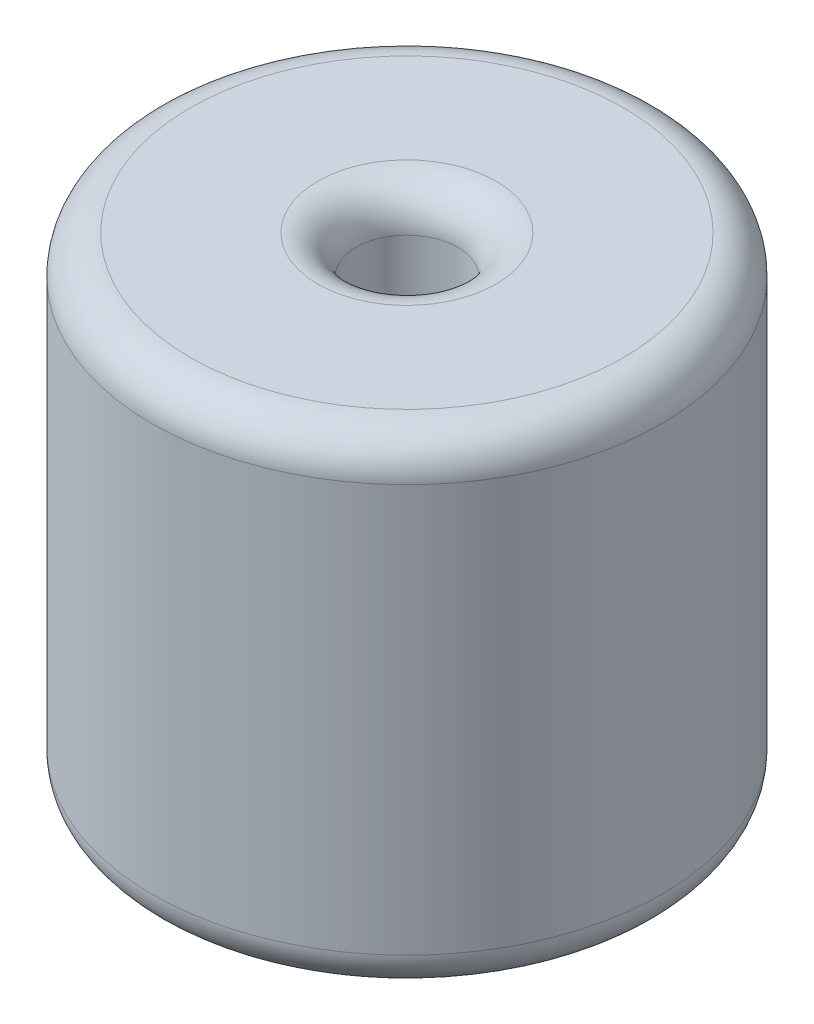
ISO-10303-21;
HEADER;
FILE_DESCRIPTION(('STEP AP214'),'2;1');
FILE_NAME('part.step','',(''),(''),'','','');
FILE_SCHEMA(('AUTOMOTIVE_DESIGN { 1 0 10303 214 1 1 1 1 }'));
ENDSEC;
DATA;
#1=APPLICATION_CONTEXT('core data for automotive mechanical design processes');
#2=APPLICATION_PROTOCOL_DEFINITION('international standard','automotive_design',2000,#1);
#3=PRODUCT_CONTEXT('',#1,'mechanical');
#4=PRODUCT('Part','Part','',(#3));
#5=PRODUCT_RELATED_PRODUCT_CATEGORY('part','',(#4));
#6=PRODUCT_DEFINITION_FORMATION('','',#4);
#7=PRODUCT_DEFINITION_CONTEXT('part definition',#1,'design');
#8=PRODUCT_DEFINITION('design','',#6,#7);
#9=PRODUCT_DEFINITION_SHAPE('','',#8);
#10=(LENGTH_UNIT() NAMED_UNIT(*) SI_UNIT(.MILLI.,.METRE.));
#11=(NAMED_UNIT(*) PLANE_ANGLE_UNIT() SI_UNIT($,.RADIAN.));
#12=(NAMED_UNIT(*) SI_UNIT($,.STERADIAN.) SOLID_ANGLE_UNIT());
#13=UNCERTAINTY_MEASURE_WITH_UNIT(LENGTH_MEASURE(1.E-05),#10,'distance_accuracy_value','');
#14=(GEOMETRIC_REPRESENTATION_CONTEXT(3) GLOBAL_UNCERTAINTY_ASSIGNED_CONTEXT((#13)) GLOBAL_UNIT_ASSIGNED_CONTEXT((#10,
#11,#12)) REPRESENTATION_CONTEXT('',''));
#15=CARTESIAN_POINT('',(0.,0.,0.));
#16=DIRECTION('',(0.,0.,1.));
#17=DIRECTION('',(1.,0.,0.));
#18=AXIS2_PLACEMENT_3D('',#15,#16,#17);
#19=CARTESIAN_POINT('',(0.,38.,0.));
#20=DIRECTION('',(0.,-1.,0.));
#21=DIRECTION('',(0.,0.,-1.));
#22=AXIS2_PLACEMENT_3D('',#19,#20,#21);
#23=CYLINDRICAL_SURFACE('',#22,20.);
#24=CARTESIAN_POINT('',(0.,3.,0.));
#25=DIRECTION('',(0.,1.,0.));
#26=DIRECTION('',(0.,0.,1.));
#27=AXIS2_PLACEMENT_3D('',#24,#25,#26);
#28=CIRCLE('',#27,20.);
#29=CARTESIAN_POINT('',(0.,3.,20.));
#30=VERTEX_POINT('',#29);
#31=EDGE_CURVE('E56',#30,#30,#28,.T.);
#32=ORIENTED_EDGE('',*,*,#31,.T.);
#33=EDGE_LOOP('',(#32));
#34=FACE_BOUND('',#33,.T.);
#35=CARTESIAN_POINT('',(0.,35.,0.));
#36=DIRECTION('',(0.,1.,0.));
#37=DIRECTION('',(0.,0.,1.));
#38=AXIS2_PLACEMENT_3D('',#35,#36,#37);
#39=CIRCLE('',#38,20.);
#40=CARTESIAN_POINT('',(0.,35.,20.));
#41=VERTEX_POINT('',#40);
#42=EDGE_CURVE('E59',#41,#41,#39,.F.);
#43=ORIENTED_EDGE('',*,*,#42,.T.);
#44=EDGE_LOOP('',(#43));
#45=FACE_BOUND('',#44,.T.);
#46=ADVANCED_FACE('F30',(#34,#45),#23,.T.);
#47=CARTESIAN_POINT('',(0.,38.,0.));
#48=DIRECTION('',(0.,1.,0.));
#49=DIRECTION('',(0.,0.,1.));
#50=AXIS2_PLACEMENT_3D('',#47,#48,#49);
#51=PLANE('',#50);
#52=CARTESIAN_POINT('',(0.,38.,0.));
#53=DIRECTION('',(0.,1.,0.));
#54=DIRECTION('',(0.,0.,1.));
#55=AXIS2_PLACEMENT_3D('',#52,#53,#54);
#56=CIRCLE('',#55,17.);
#57=CARTESIAN_POINT('',(0.,38.,17.));
#58=VERTEX_POINT('',#57);
#59=EDGE_CURVE('E10',#58,#58,#56,.T.);
#60=ORIENTED_EDGE('',*,*,#59,.T.);
#61=EDGE_LOOP('',(#60));
#62=FACE_BOUND('',#61,.T.);
#63=CARTESIAN_POINT('',(0.,38.,0.));
#64=DIRECTION('',(0.,1.,0.));
#65=DIRECTION('',(0.,0.,1.));
#66=AXIS2_PLACEMENT_3D('',#63,#64,#65);
#67=CIRCLE('',#66,7.);
#68=CARTESIAN_POINT('',(0.,38.,7.));
#69=VERTEX_POINT('',#68);
#70=EDGE_CURVE('E37',#69,#69,#67,.F.);
#71=ORIENTED_EDGE('',*,*,#70,.T.);
#72=EDGE_LOOP('',(#71));
#73=FACE_BOUND('',#72,.T.);
#74=ADVANCED_FACE('F77',(#62,#73),#51,.T.);
#75=CARTESIAN_POINT('',(0.,0.,0.));
#76=DIRECTION('',(0.,1.,0.));
#77=DIRECTION('',(0.,0.,1.));
#78=AXIS2_PLACEMENT_3D('',#75,#76,#77);
#79=PLANE('',#78);
#80=CARTESIAN_POINT('',(0.,0.,0.));
#81=DIRECTION('',(0.,1.,0.));
#82=DIRECTION('',(0.,0.,1.));
#83=AXIS2_PLACEMENT_3D('',#80,#81,#82);
#84=CIRCLE('',#83,17.);
#85=CARTESIAN_POINT('',(0.,0.,17.));
#86=VERTEX_POINT('',#85);
#87=EDGE_CURVE('E50',#86,#86,#84,.F.);
#88=ORIENTED_EDGE('',*,*,#87,.T.);
#89=EDGE_LOOP('',(#88));
#90=FACE_BOUND('',#89,.T.);
#91=CARTESIAN_POINT('',(0.,0.,0.));
#92=DIRECTION('',(0.,1.,0.));
#93=DIRECTION('',(0.,0.,1.));
#94=AXIS2_PLACEMENT_3D('',#91,#92,#93);
#95=CIRCLE('',#94,7.);
#96=CARTESIAN_POINT('',(0.,0.,7.));
#97=VERTEX_POINT('',#96);
#98=EDGE_CURVE('E53',#97,#97,#95,.T.);
#99=ORIENTED_EDGE('',*,*,#98,.T.);
#100=EDGE_LOOP('',(#99));
#101=FACE_BOUND('',#100,.T.);
#102=ADVANCED_FACE('F83',(#90,#101),#79,.F.);
#103=CARTESIAN_POINT('',(0.,0.,0.));
#104=DIRECTION('',(0.,1.,0.));
#105=DIRECTION('',(0.,0.,1.));
#106=AXIS2_PLACEMENT_3D('',#103,#104,#105);
#107=CYLINDRICAL_SURFACE('',#106,4.);
#108=CARTESIAN_POINT('',(0.,3.,0.));
#109=DIRECTION('',(0.,1.,0.));
#110=DIRECTION('',(0.,0.,1.));
#111=AXIS2_PLACEMENT_3D('',#108,#109,#110);
#112=CIRCLE('',#111,4.);
#113=CARTESIAN_POINT('',(0.,3.,4.));
#114=VERTEX_POINT('',#113);
#115=EDGE_CURVE('E41',#114,#114,#112,.F.);
#116=ORIENTED_EDGE('',*,*,#115,.T.);
#117=EDGE_LOOP('',(#116));
#118=FACE_BOUND('',#117,.T.);
#119=CARTESIAN_POINT('',(0.,35.,0.));
#120=DIRECTION('',(0.,1.,0.));
#121=DIRECTION('',(0.,0.,1.));
#122=AXIS2_PLACEMENT_3D('',#119,#120,#121);
#123=CIRCLE('',#122,4.);
#124=CARTESIAN_POINT('',(0.,35.,4.));
#125=VERTEX_POINT('',#124);
#126=EDGE_CURVE('E45',#125,#125,#123,.T.);
#127=ORIENTED_EDGE('',*,*,#126,.T.);
#128=EDGE_LOOP('',(#127));
#129=FACE_BOUND('',#128,.T.);
#130=ADVANCED_FACE('F88',(#118,#129),#107,.F.);
#131=CARTESIAN_POINT('',(0.,3.,0.));
#132=DIRECTION('',(0.,1.,0.));
#133=DIRECTION('',(0.,0.,1.));
#134=AXIS2_PLACEMENT_3D('',#131,#132,#133);
#135=TOROIDAL_SURFACE('',#134,17.,3.);
#136=ORIENTED_EDGE('',*,*,#87,.F.);
#137=EDGE_LOOP('',(#136));
#138=FACE_BOUND('',#137,.T.);
#139=ORIENTED_EDGE('',*,*,#31,.F.);
#140=EDGE_LOOP('',(#139));
#141=FACE_BOUND('',#140,.T.);
#142=ADVANCED_FACE('F73',(#138,#141),#135,.T.);
#143=CARTESIAN_POINT('',(0.,3.,0.));
#144=DIRECTION('',(0.,1.,0.));
#145=DIRECTION('',(0.,0.,1.));
#146=AXIS2_PLACEMENT_3D('',#143,#144,#145);
#147=TOROIDAL_SURFACE('',#146,7.,3.);
#148=ORIENTED_EDGE('',*,*,#115,.F.);
#149=EDGE_LOOP('',(#148));
#150=FACE_BOUND('',#149,.T.);
#151=ORIENTED_EDGE('',*,*,#98,.F.);
#152=EDGE_LOOP('',(#151));
#153=FACE_BOUND('',#152,.T.);
#154=ADVANCED_FACE('F67',(#150,#153),#147,.T.);
#155=CARTESIAN_POINT('',(0.,35.,0.));
#156=DIRECTION('',(0.,1.,0.));
#157=DIRECTION('',(0.,0.,1.));
#158=AXIS2_PLACEMENT_3D('',#155,#156,#157);
#159=TOROIDAL_SURFACE('',#158,17.,3.);
#160=ORIENTED_EDGE('',*,*,#42,.F.);
#161=EDGE_LOOP('',(#160));
#162=FACE_BOUND('',#161,.T.);
#163=ORIENTED_EDGE('',*,*,#59,.F.);
#164=EDGE_LOOP('',(#163));
#165=FACE_BOUND('',#164,.T.);
#166=ADVANCED_FACE('F64',(#162,#165),#159,.T.);
#167=CARTESIAN_POINT('',(0.,35.,0.));
#168=DIRECTION('',(0.,1.,0.));
#169=DIRECTION('',(0.,0.,1.));
#170=AXIS2_PLACEMENT_3D('',#167,#168,#169);
#171=TOROIDAL_SURFACE('',#170,7.,3.);
#172=ORIENTED_EDGE('',*,*,#70,.F.);
#173=EDGE_LOOP('',(#172));
#174=FACE_BOUND('',#173,.T.);
#175=ORIENTED_EDGE('',*,*,#126,.F.);
#176=EDGE_LOOP('',(#175));
#177=FACE_BOUND('',#176,.T.);
#178=ADVANCED_FACE('F32',(#174,#177),#171,.T.);
#179=CLOSED_SHELL('',(#46,#74,#102,#130,#142,#154,#166,#178));
#180=MANIFOLD_SOLID_BREP('B2',#179);
#181=ADVANCED_BREP_SHAPE_REPRESENTATION('',(#18,#180),#14);
#182=SHAPE_DEFINITION_REPRESENTATION(#9,#181);
ENDSEC;
END-ISO-10303-21;
